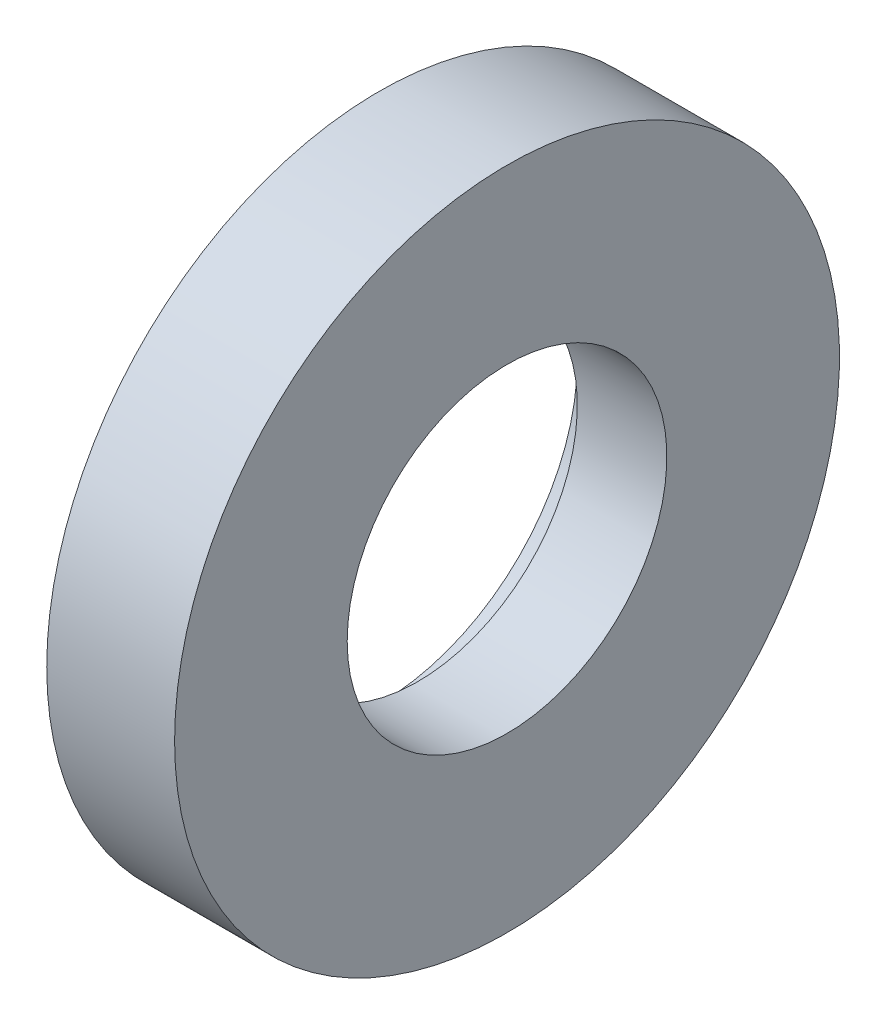
ISO-10303-21;
HEADER;
FILE_DESCRIPTION(('STEP AP214'),'2;1');
FILE_NAME('part.step','',(''),(''),'','','');
FILE_SCHEMA(('AUTOMOTIVE_DESIGN { 1 0 10303 214 1 1 1 1 }'));
ENDSEC;
DATA;
#1=APPLICATION_CONTEXT('core data for automotive mechanical design processes');
#2=APPLICATION_PROTOCOL_DEFINITION('international standard','automotive_design',2000,#1);
#3=PRODUCT_CONTEXT('',#1,'mechanical');
#4=PRODUCT('Part','Part','',(#3));
#5=PRODUCT_RELATED_PRODUCT_CATEGORY('part','',(#4));
#6=PRODUCT_DEFINITION_FORMATION('','',#4);
#7=PRODUCT_DEFINITION_CONTEXT('part definition',#1,'design');
#8=PRODUCT_DEFINITION('design','',#6,#7);
#9=PRODUCT_DEFINITION_SHAPE('','',#8);
#10=(LENGTH_UNIT() NAMED_UNIT(*) SI_UNIT(.MILLI.,.METRE.));
#11=(NAMED_UNIT(*) PLANE_ANGLE_UNIT() SI_UNIT($,.RADIAN.));
#12=(NAMED_UNIT(*) SI_UNIT($,.STERADIAN.) SOLID_ANGLE_UNIT());
#13=UNCERTAINTY_MEASURE_WITH_UNIT(LENGTH_MEASURE(1.E-05),#10,'distance_accuracy_value','');
#14=(GEOMETRIC_REPRESENTATION_CONTEXT(3) GLOBAL_UNCERTAINTY_ASSIGNED_CONTEXT((#13)) GLOBAL_UNIT_ASSIGNED_CONTEXT((#10,
#11,#12)) REPRESENTATION_CONTEXT('',''));
#15=CARTESIAN_POINT('',(0.,0.,0.));
#16=DIRECTION('',(0.,0.,1.));
#17=DIRECTION('',(1.,0.,0.));
#18=AXIS2_PLACEMENT_3D('',#15,#16,#17);
#19=CARTESIAN_POINT('',(-24.149081803005,0.,0.));
#20=DIRECTION('',(-1.,0.,0.));
#21=DIRECTION('',(0.,0.,1.));
#22=AXIS2_PLACEMENT_3D('',#19,#20,#21);
#23=CYLINDRICAL_SURFACE('',#22,15.5);
#24=CARTESIAN_POINT('',(3.,0.,0.));
#25=DIRECTION('',(-1.,0.,0.));
#26=DIRECTION('',(0.,0.,1.));
#27=AXIS2_PLACEMENT_3D('',#24,#25,#26);
#28=CIRCLE('',#27,15.5);
#29=CARTESIAN_POINT('',(3.,0.,15.5));
#30=VERTEX_POINT('',#29);
#31=EDGE_CURVE('E54',#30,#30,#28,.T.);
#32=ORIENTED_EDGE('',*,*,#31,.F.);
#33=EDGE_LOOP('',(#32));
#34=FACE_BOUND('',#33,.T.);
#35=CARTESIAN_POINT('',(0.,0.,0.));
#36=DIRECTION('',(-1.,0.,0.));
#37=DIRECTION('',(0.,0.,1.));
#38=AXIS2_PLACEMENT_3D('',#35,#36,#37);
#39=CIRCLE('',#38,15.5);
#40=CARTESIAN_POINT('',(0.,0.,15.5));
#41=VERTEX_POINT('',#40);
#42=EDGE_CURVE('E10',#41,#41,#39,.T.);
#43=ORIENTED_EDGE('',*,*,#42,.T.);
#44=EDGE_LOOP('',(#43));
#45=FACE_BOUND('',#44,.T.);
#46=ADVANCED_FACE('F32',(#34,#45),#23,.F.);
#47=CARTESIAN_POINT('',(0.,15.5,0.));
#48=DIRECTION('',(1.,0.,0.));
#49=DIRECTION('',(0.,0.,-1.));
#50=AXIS2_PLACEMENT_3D('',#47,#48,#49);
#51=PLANE('',#50);
#52=ORIENTED_EDGE('',*,*,#42,.F.);
#53=EDGE_LOOP('',(#52));
#54=FACE_BOUND('',#53,.T.);
#55=CARTESIAN_POINT('',(0.,0.,0.));
#56=DIRECTION('',(-1.,0.,0.));
#57=DIRECTION('',(0.,0.,1.));
#58=AXIS2_PLACEMENT_3D('',#55,#56,#57);
#59=CIRCLE('',#58,26.);
#60=CARTESIAN_POINT('',(0.,0.,26.));
#61=VERTEX_POINT('',#60);
#62=EDGE_CURVE('E38',#61,#61,#59,.T.);
#63=ORIENTED_EDGE('',*,*,#62,.T.);
#64=EDGE_LOOP('',(#63));
#65=FACE_BOUND('',#64,.T.);
#66=ADVANCED_FACE('F61',(#54,#65),#51,.F.);
#67=CARTESIAN_POINT('',(-24.149081803005,0.,0.));
#68=DIRECTION('',(-1.,0.,0.));
#69=DIRECTION('',(0.,0.,1.));
#70=AXIS2_PLACEMENT_3D('',#67,#68,#69);
#71=CYLINDRICAL_SURFACE('',#70,26.);
#72=ORIENTED_EDGE('',*,*,#62,.F.);
#73=EDGE_LOOP('',(#72));
#74=FACE_BOUND('',#73,.T.);
#75=CARTESIAN_POINT('',(10.,0.,0.));
#76=DIRECTION('',(-1.,0.,0.));
#77=DIRECTION('',(0.,0.,1.));
#78=AXIS2_PLACEMENT_3D('',#75,#76,#77);
#79=CIRCLE('',#78,26.);
#80=CARTESIAN_POINT('',(10.,0.,26.));
#81=VERTEX_POINT('',#80);
#82=EDGE_CURVE('E42',#81,#81,#79,.T.);
#83=ORIENTED_EDGE('',*,*,#82,.T.);
#84=EDGE_LOOP('',(#83));
#85=FACE_BOUND('',#84,.T.);
#86=ADVANCED_FACE('F65',(#74,#85),#71,.T.);
#87=CARTESIAN_POINT('',(10.,26.,0.));
#88=DIRECTION('',(-1.,0.,0.));
#89=DIRECTION('',(0.,0.,1.));
#90=AXIS2_PLACEMENT_3D('',#87,#88,#89);
#91=PLANE('',#90);
#92=ORIENTED_EDGE('',*,*,#82,.F.);
#93=EDGE_LOOP('',(#92));
#94=FACE_BOUND('',#93,.T.);
#95=CARTESIAN_POINT('',(10.,0.,0.));
#96=DIRECTION('',(-1.,0.,0.));
#97=DIRECTION('',(0.,0.,1.));
#98=AXIS2_PLACEMENT_3D('',#95,#96,#97);
#99=CIRCLE('',#98,12.5);
#100=CARTESIAN_POINT('',(10.,0.,12.5));
#101=VERTEX_POINT('',#100);
#102=EDGE_CURVE('E46',#101,#101,#99,.T.);
#103=ORIENTED_EDGE('',*,*,#102,.T.);
#104=EDGE_LOOP('',(#103));
#105=FACE_BOUND('',#104,.T.);
#106=ADVANCED_FACE('F70',(#94,#105),#91,.F.);
#107=CARTESIAN_POINT('',(-24.149081803005,0.,0.));
#108=DIRECTION('',(-1.,0.,0.));
#109=DIRECTION('',(0.,0.,1.));
#110=AXIS2_PLACEMENT_3D('',#107,#108,#109);
#111=CYLINDRICAL_SURFACE('',#110,12.5);
#112=ORIENTED_EDGE('',*,*,#102,.F.);
#113=EDGE_LOOP('',(#112));
#114=FACE_BOUND('',#113,.T.);
#115=CARTESIAN_POINT('',(3.,0.,0.));
#116=DIRECTION('',(-1.,0.,0.));
#117=DIRECTION('',(0.,0.,1.));
#118=AXIS2_PLACEMENT_3D('',#115,#116,#117);
#119=CIRCLE('',#118,12.5);
#120=CARTESIAN_POINT('',(3.,0.,12.5));
#121=VERTEX_POINT('',#120);
#122=EDGE_CURVE('E51',#121,#121,#119,.T.);
#123=ORIENTED_EDGE('',*,*,#122,.T.);
#124=EDGE_LOOP('',(#123));
#125=FACE_BOUND('',#124,.T.);
#126=ADVANCED_FACE('F76',(#114,#125),#111,.F.);
#127=CARTESIAN_POINT('',(3.,12.5,0.));
#128=DIRECTION('',(1.,0.,0.));
#129=DIRECTION('',(0.,0.,-1.));
#130=AXIS2_PLACEMENT_3D('',#127,#128,#129);
#131=PLANE('',#130);
#132=ORIENTED_EDGE('',*,*,#122,.F.);
#133=EDGE_LOOP('',(#132));
#134=FACE_BOUND('',#133,.T.);
#135=ORIENTED_EDGE('',*,*,#31,.T.);
#136=EDGE_LOOP('',(#135));
#137=FACE_BOUND('',#136,.T.);
#138=ADVANCED_FACE('F58',(#134,#137),#131,.F.);
#139=CLOSED_SHELL('',(#46,#66,#86,#106,#126,#138));
#140=MANIFOLD_SOLID_BREP('B2',#139);
#141=ADVANCED_BREP_SHAPE_REPRESENTATION('',(#18,#140),#14);
#142=SHAPE_DEFINITION_REPRESENTATION(#9,#141);
ENDSEC;
END-ISO-10303-21;
